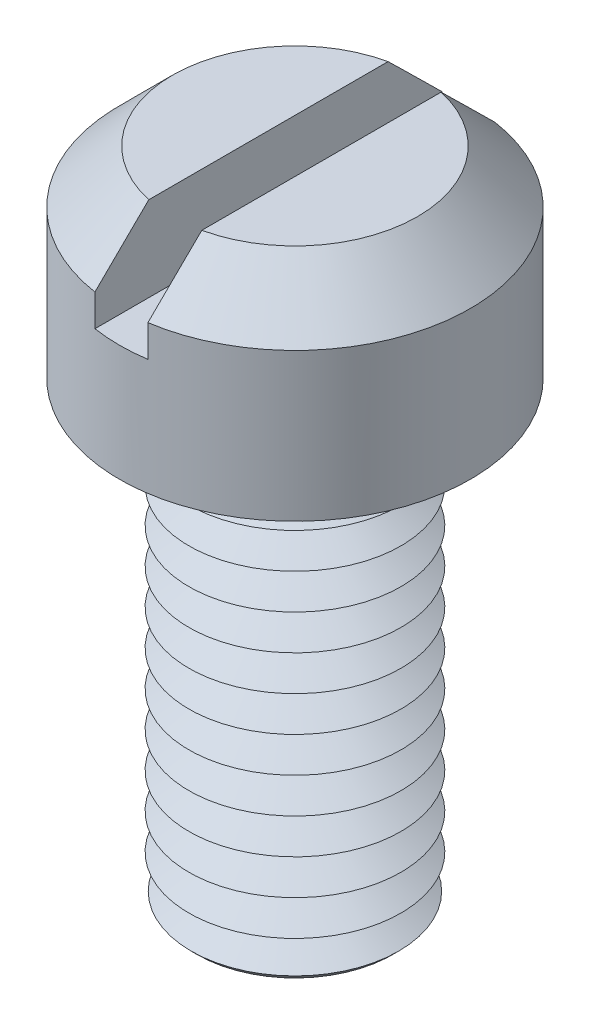
ISO-10303-21;
HEADER;
FILE_DESCRIPTION(('STEP AP214'),'2;1');
FILE_NAME('part.step','',(''),(''),'','','');
FILE_SCHEMA(('AUTOMOTIVE_DESIGN { 1 0 10303 214 1 1 1 1 }'));
ENDSEC;
DATA;
#1=APPLICATION_CONTEXT('core data for automotive mechanical design processes');
#2=APPLICATION_PROTOCOL_DEFINITION('international standard','automotive_design',2000,#1);
#3=PRODUCT_CONTEXT('',#1,'mechanical');
#4=PRODUCT('Part','Part','',(#3));
#5=PRODUCT_RELATED_PRODUCT_CATEGORY('part','',(#4));
#6=PRODUCT_DEFINITION_FORMATION('','',#4);
#7=PRODUCT_DEFINITION_CONTEXT('part definition',#1,'design');
#8=PRODUCT_DEFINITION('design','',#6,#7);
#9=PRODUCT_DEFINITION_SHAPE('','',#8);
#10=(LENGTH_UNIT() NAMED_UNIT(*) SI_UNIT(.MILLI.,.METRE.));
#11=(NAMED_UNIT(*) PLANE_ANGLE_UNIT() SI_UNIT($,.RADIAN.));
#12=(NAMED_UNIT(*) SI_UNIT($,.STERADIAN.) SOLID_ANGLE_UNIT());
#13=UNCERTAINTY_MEASURE_WITH_UNIT(LENGTH_MEASURE(1.E-05),#10,'distance_accuracy_value','');
#14=(GEOMETRIC_REPRESENTATION_CONTEXT(3) GLOBAL_UNCERTAINTY_ASSIGNED_CONTEXT((#13)) GLOBAL_UNIT_ASSIGNED_CONTEXT((#10,
#11,#12)) REPRESENTATION_CONTEXT('',''));
#15=CARTESIAN_POINT('',(0.,0.,0.));
#16=DIRECTION('',(0.,0.,1.));
#17=DIRECTION('',(1.,0.,0.));
#18=AXIS2_PLACEMENT_3D('',#15,#16,#17);
#19=CARTESIAN_POINT('',(1.2625832,2.0708112,0.));
#20=DIRECTION('',(0.,1.,0.));
#21=DIRECTION('',(0.,0.,1.));
#22=AXIS2_PLACEMENT_3D('',#19,#20,#21);
#23=PLANE('',#22);
#24=DIRECTION('',(0.,0.,1.));
#25=VECTOR('',#24,1.);
#26=CARTESIAN_POINT('',(-0.27305,2.0708112,-16.0764816511119));
#27=LINE('',#26,#25);
#28=CARTESIAN_POINT('',(-0.27305,2.0708112,-1.23270435807708));
#29=VERTEX_POINT('',#28);
#30=CARTESIAN_POINT('',(-0.27305,2.0708112,1.23270435807708));
#31=VERTEX_POINT('',#30);
#32=EDGE_CURVE('E86',#29,#31,#27,.T.);
#33=ORIENTED_EDGE('',*,*,#32,.F.);
#34=CARTESIAN_POINT('',(0.,2.0708112,0.));
#35=DIRECTION('',(0.,-1.,0.));
#36=DIRECTION('',(0.,0.,-1.));
#37=AXIS2_PLACEMENT_3D('',#34,#35,#36);
#38=CIRCLE('',#37,1.2625832);
#39=EDGE_CURVE('E95',#31,#29,#38,.T.);
#40=ORIENTED_EDGE('',*,*,#39,.F.);
#41=EDGE_LOOP('',(#33,#40));
#42=FACE_BOUND('',#41,.T.);
#43=ADVANCED_FACE('F32',(#42),#23,.T.);
#44=CARTESIAN_POINT('',(0.,1.5247112,0.));
#45=DIRECTION('',(0.,-1.,0.));
#46=DIRECTION('',(0.,0.,-1.));
#47=AXIS2_PLACEMENT_3D('',#44,#45,#46);
#48=CONICAL_SURFACE('',#47,1.8086832,0.785398163397452);
#49=CARTESIAN_POINT('',(-0.27305,-0.670502093232101,-3.99457517466081));
#50=CARTESIAN_POINT('',(-0.27305,-0.532743501954216,-3.85649244203936));
#51=CARTESIAN_POINT('',(-0.27305,-0.394999038745188,-3.71839559930553));
#52=CARTESIAN_POINT('',(-0.27305,-0.119553690384869,-3.44215193202548));
#53=CARTESIAN_POINT('',(-0.27305,0.0181471936555657,-3.30400510637165));
#54=CARTESIAN_POINT('',(-0.27305,0.29355811836415,-3.02757138990339));
#55=CARTESIAN_POINT('',(-0.27305,0.431268123568295,-2.8892844637545));
#56=CARTESIAN_POINT('',(-0.27305,0.706585658788172,-2.61261495548582));
#57=CARTESIAN_POINT('',(-0.27305,0.844193191098444,-2.47423237565038));
#58=CARTESIAN_POINT('',(-0.27305,1.11973373240248,-2.19681511027986));
#59=CARTESIAN_POINT('',(-0.27305,1.25766616513742,-2.05777985247029));
#60=CARTESIAN_POINT('',(-0.27305,1.53325800638488,-1.77941983139988));
#61=CARTESIAN_POINT('',(-0.27305,1.67091739578055,-1.64009504917592));
#62=CARTESIAN_POINT('',(-0.27305,1.87693359768065,-1.43068933920297));
#63=CARTESIAN_POINT('',(-0.27305,1.94551520818137,-1.36082961648617));
#64=CARTESIAN_POINT('',(-0.27305,2.08244301610567,-1.22087555600015));
#65=CARTESIAN_POINT('',(-0.27305,2.15078920708293,-1.15078121190849));
#66=CARTESIAN_POINT('',(-0.27305,2.28707167761759,-1.01021264326538));
#67=CARTESIAN_POINT('',(-0.27305,2.35500800747683,-0.939738467426579));
#68=CARTESIAN_POINT('',(-0.27305,2.49015756455895,-0.798100988856253));
#69=CARTESIAN_POINT('',(-0.27305,2.55737083504489,-0.726937727844574));
#70=CARTESIAN_POINT('',(-0.27305,2.64181728236521,-0.635433243349678));
#71=CARTESIAN_POINT('',(-0.27305,2.65981927614082,-0.615803159546204));
#72=CARTESIAN_POINT('',(-0.27305,2.69565472326073,-0.576388644290862));
#73=CARTESIAN_POINT('',(-0.27305,2.71348817154666,-0.556604208238902));
#74=CARTESIAN_POINT('',(-0.27305,2.74894836778317,-0.516819826621165));
#75=CARTESIAN_POINT('',(-0.27305,2.7665749283345,-0.496819713073399));
#76=CARTESIAN_POINT('',(-0.27305,2.80151416477243,-0.456551062853943));
#77=CARTESIAN_POINT('',(-0.27305,2.81882686131552,-0.436282543999979));
#78=CARTESIAN_POINT('',(-0.27305,2.86353511103527,-0.382818629339714));
#79=CARTESIAN_POINT('',(-0.27305,2.89059128785077,-0.349330956102617));
#80=CARTESIAN_POINT('',(-0.27305,2.9294959253438,-0.297826266492167));
#81=CARTESIAN_POINT('',(-0.27305,2.9421832998598,-0.280447208551324));
#82=CARTESIAN_POINT('',(-0.27305,2.96669883466568,-0.245097559607347));
#83=CARTESIAN_POINT('',(-0.27305,2.97852742850139,-0.227127273832052));
#84=CARTESIAN_POINT('',(-0.27305,3.00079829496485,-0.190461363836853));
#85=CARTESIAN_POINT('',(-0.27305,3.01124750560347,-0.171770032705802));
#86=CARTESIAN_POINT('',(-0.27305,3.02999784335078,-0.133319136469084));
#87=CARTESIAN_POINT('',(-0.27305,3.03830202355649,-0.113561138592454));
#88=CARTESIAN_POINT('',(-0.27305,3.04998937794698,-0.0773657560245886));
#89=CARTESIAN_POINT('',(-0.27305,3.05405408357777,-0.0611576770965087));
#90=CARTESIAN_POINT('',(-0.27305,3.05935542411927,-0.0283043030006355));
#91=CARTESIAN_POINT('',(-0.27305,3.06060025848282,-0.0116604181774456));
#92=CARTESIAN_POINT('',(-0.27305,3.05999800610169,0.0216049530590745));
#93=CARTESIAN_POINT('',(-0.27305,3.05814393619912,0.0382263041863533));
#94=CARTESIAN_POINT('',(-0.27305,3.05173842402711,0.0709505462754175));
#95=CARTESIAN_POINT('',(-0.27305,3.04718025593288,0.0870520385500609));
#96=CARTESIAN_POINT('',(-0.27305,3.0352858412563,0.120824759627516));
#97=CARTESIAN_POINT('',(-0.27305,3.02764174495537,0.138383218501545));
#98=CARTESIAN_POINT('',(-0.27305,3.01066839146767,0.172679835921953));
#99=CARTESIAN_POINT('',(-0.27305,3.0013356509551,0.189416206192335));
#100=CARTESIAN_POINT('',(-0.27305,2.98149860243591,0.22237090140512));
#101=CARTESIAN_POINT('',(-0.27305,2.97098463345682,0.23858331173284));
#102=CARTESIAN_POINT('',(-0.27305,2.94922961836882,0.270482843280437));
#103=CARTESIAN_POINT('',(-0.27305,2.93798930016294,0.286170467190459));
#104=CARTESIAN_POINT('',(-0.27305,2.9011739210663,0.335846327154306));
#105=CARTESIAN_POINT('',(-0.27305,2.87463987792527,0.369118440780245));
#106=CARTESIAN_POINT('',(-0.27305,2.82038440773294,0.434685670528269));
#107=CARTESIAN_POINT('',(-0.27305,2.79266229676699,0.466980205147229));
#108=CARTESIAN_POINT('',(-0.27305,2.73648427347563,0.531020112756568));
#109=CARTESIAN_POINT('',(-0.27305,2.70802720933309,0.562764474804895));
#110=CARTESIAN_POINT('',(-0.27305,2.65069398421821,0.625854747084333));
#111=CARTESIAN_POINT('',(-0.27305,2.62181793478477,0.657200759339066));
#112=CARTESIAN_POINT('',(-0.27305,2.53504619814765,0.750558636192267));
#113=CARTESIAN_POINT('',(-0.27305,2.47673978737696,0.812188172853045));
#114=CARTESIAN_POINT('',(-0.27305,2.35963624039586,0.93486240885009));
#115=CARTESIAN_POINT('',(-0.27305,2.30083963000779,0.99590761359902));
#116=CARTESIAN_POINT('',(-0.27305,2.12215621990625,1.1804787652528));
#117=CARTESIAN_POINT('',(-0.27305,2.00178360140104,1.3035340410143));
#118=CARTESIAN_POINT('',(-0.27305,1.76052653862261,1.54914383709942));
#119=CARTESIAN_POINT('',(-0.27305,1.63964208431354,1.6716983475108));
#120=CARTESIAN_POINT('',(-0.27305,1.39753876398271,1.91659214765937));
#121=CARTESIAN_POINT('',(-0.27305,1.27631976628164,2.03893130735173));
#122=CARTESIAN_POINT('',(-0.27305,1.03372474745032,2.2834517814165));
#123=CARTESIAN_POINT('',(-0.27305,0.912348727527343,2.40563309698824));
#124=CARTESIAN_POINT('',(-0.27305,0.54755124084544,2.77255725983145));
#125=CARTESIAN_POINT('',(-0.27305,0.303982373837481,3.01715356856809));
#126=CARTESIAN_POINT('',(-0.27305,-0.0614420244602978,3.38385157729834));
#127=CARTESIAN_POINT('',(-0.27305,-0.183230617478816,3.5060200516536));
#128=CARTESIAN_POINT('',(-0.27305,-0.426842566146336,3.75032166568043));
#129=CARTESIAN_POINT('',(-0.27305,-0.548665921698652,3.87245480544841));
#130=CARTESIAN_POINT('',(-0.27305,-0.670502093232101,3.99457517466081));
#131=B_SPLINE_CURVE_WITH_KNOTS('',3,(#49,#50,#51,#52,#53,#54,#55,#56,#57,#58,#59,#60,#61,#62,
#63,#64,#65,#66,#67,#68,#69,#70,#71,#72,#73,#74,#75,#76,#77,#78,#79,#80,#81,#82,#83,#84,#85,#86,
#87,#88,#89,#90,#91,#92,#93,#94,#95,#96,#97,#98,#99,#100,#101,#102,#103,#104,#105,#106,#107,
#108,#109,#110,#111,#112,#113,#114,#115,#116,#117,#118,#119,#120,#121,#122,#123,#124,#125,#126,
#127,#128,#129,#130),.UNSPECIFIED.,.F.,.F.,(4,2,2,2,2,2,2,2,2,2,2,2,2,2,2,2,2,2,2,2,2,2,2,2,2,2,
2,2,2,2,2,2,2,2,2,2,2,2,2,2,4),(0.,0.585148232338538,1.17031034071826,1.75578950392684,
2.34125513740581,2.92879692748821,3.51637849600159,3.81006923278803,4.1037679485656,
4.39742985419415,4.69107409021423,4.77097762606449,4.85088355241081,4.93085700059561,
5.01082516620193,5.13991833554693,5.20445511581137,5.26895908552851,5.33312513249446,
5.39719934006627,5.44713494673529,5.49692516622787,5.54682773573501,5.59685494994307,
5.6541658416076,5.71159633033682,5.76953642388336,5.82741932780626,5.9550200729413,
6.08269528527661,6.21058444875507,6.33844016947771,6.59295157416525,6.84721822957657,
7.3636323805298,7.88005670442245,8.39672658465497,8.91339251579066,9.94894919912361,
10.4664609237501,10.9839712227619),.UNSPECIFIED.);
#132=CARTESIAN_POINT('',(-0.27305,1.5247112,-1.78795375092932));
#133=VERTEX_POINT('',#132);
#134=EDGE_CURVE('E83',#133,#29,#131,.T.);
#135=ORIENTED_EDGE('',*,*,#134,.F.);
#136=CARTESIAN_POINT('',(0.,1.5247112,0.));
#137=DIRECTION('',(0.,-1.,0.));
#138=DIRECTION('',(0.,0.,-1.));
#139=AXIS2_PLACEMENT_3D('',#136,#137,#138);
#140=CIRCLE('',#139,1.8086832);
#141=CARTESIAN_POINT('',(-0.27305,1.5247112,1.78795375092932));
#142=VERTEX_POINT('',#141);
#143=EDGE_CURVE('E101',#142,#133,#140,.T.);
#144=ORIENTED_EDGE('',*,*,#143,.F.);
#145=EDGE_CURVE('E92',#31,#142,#131,.T.);
#146=ORIENTED_EDGE('',*,*,#145,.F.);
#147=ORIENTED_EDGE('',*,*,#39,.T.);
#148=EDGE_LOOP('',(#135,#144,#146,#147));
#149=FACE_BOUND('',#148,.T.);
#150=ADVANCED_FACE('F97',(#149),#48,.T.);
#151=CARTESIAN_POINT('',(0.,-4.41113333333331,0.));
#152=DIRECTION('',(0.,-1.,0.));
#153=DIRECTION('',(0.,0.,-1.));
#154=AXIS2_PLACEMENT_3D('',#151,#152,#153);
#155=CONICAL_SURFACE('',#154,0.776909017995548,1.0471975511966);
#156=CARTESIAN_POINT('',(0.,-4.57984090179954,0.));
#157=DIRECTION('',(0.,-1.,0.));
#158=DIRECTION('',(0.,0.,-1.));
#159=AXIS2_PLACEMENT_3D('',#156,#157,#158);
#160=CIRCLE('',#159,1.06911909820046);
#161=CARTESIAN_POINT('',(0.,-4.57984090179954,-1.06911909820046));
#162=VERTEX_POINT('',#161);
#163=EDGE_CURVE('E191',#162,#162,#160,.F.);
#164=ORIENTED_EDGE('',*,*,#163,.T.);
#165=EDGE_LOOP('',(#164));
#166=FACE_BOUND('',#165,.T.);
#167=CARTESIAN_POINT('',(0.,-4.41113333333331,0.));
#168=DIRECTION('',(0.,-1.,0.));
#169=DIRECTION('',(0.,0.,-1.));
#170=AXIS2_PLACEMENT_3D('',#167,#168,#169);
#171=CIRCLE('',#170,0.776909017995548);
#172=CARTESIAN_POINT('',(0.,-4.41113333333331,-0.776909017995548));
#173=VERTEX_POINT('',#172);
#174=EDGE_CURVE('E185',#173,#173,#171,.T.);
#175=ORIENTED_EDGE('',*,*,#174,.T.);
#176=EDGE_LOOP('',(#175));
#177=FACE_BOUND('',#176,.T.);
#178=ADVANCED_FACE('F231',(#166,#177),#155,.T.);
#179=CARTESIAN_POINT('',(0.,-4.22909999999997,0.));
#180=DIRECTION('',(0.,1.,0.));
#181=DIRECTION('',(0.,0.,1.));
#182=AXIS2_PLACEMENT_3D('',#179,#180,#181);
#183=CONICAL_SURFACE('',#182,1.0922,1.04719755119658);
#184=ORIENTED_EDGE('',*,*,#174,.F.);
#185=EDGE_LOOP('',(#184));
#186=FACE_BOUND('',#185,.T.);
#187=CARTESIAN_POINT('',(0.,-4.22909999999997,0.));
#188=DIRECTION('',(0.,-1.,0.));
#189=DIRECTION('',(0.,0.,-1.));
#190=AXIS2_PLACEMENT_3D('',#187,#188,#189);
#191=CIRCLE('',#190,1.0922);
#192=CARTESIAN_POINT('',(0.,-4.22909999999997,-1.0922));
#193=VERTEX_POINT('',#192);
#194=EDGE_CURVE('E182',#193,#193,#191,.T.);
#195=ORIENTED_EDGE('',*,*,#194,.T.);
#196=EDGE_LOOP('',(#195));
#197=FACE_BOUND('',#196,.T.);
#198=ADVANCED_FACE('F575',(#186,#197),#183,.T.);
#199=CARTESIAN_POINT('',(0.,-4.04706666666664,0.));
#200=DIRECTION('',(0.,-1.,0.));
#201=DIRECTION('',(0.,0.,-1.));
#202=AXIS2_PLACEMENT_3D('',#199,#200,#201);
#203=CONICAL_SURFACE('',#202,0.776909017995548,1.0471975511966);
#204=ORIENTED_EDGE('',*,*,#194,.F.);
#205=EDGE_LOOP('',(#204));
#206=FACE_BOUND('',#205,.T.);
#207=CARTESIAN_POINT('',(0.,-4.04706666666664,0.));
#208=DIRECTION('',(0.,-1.,0.));
#209=DIRECTION('',(0.,0.,-1.));
#210=AXIS2_PLACEMENT_3D('',#207,#208,#209);
#211=CIRCLE('',#210,0.776909017995548);
#212=CARTESIAN_POINT('',(0.,-4.04706666666664,-0.776909017995548));
#213=VERTEX_POINT('',#212);
#214=EDGE_CURVE('E179',#213,#213,#211,.T.);
#215=ORIENTED_EDGE('',*,*,#214,.T.);
#216=EDGE_LOOP('',(#215));
#217=FACE_BOUND('',#216,.T.);
#218=ADVANCED_FACE('F565',(#206,#217),#203,.T.);
#219=CARTESIAN_POINT('',(0.,-3.86503333333331,0.));
#220=DIRECTION('',(0.,1.,0.));
#221=DIRECTION('',(0.,0.,1.));
#222=AXIS2_PLACEMENT_3D('',#219,#220,#221);
#223=CONICAL_SURFACE('',#222,1.0922,1.0471975511966);
#224=ORIENTED_EDGE('',*,*,#214,.F.);
#225=EDGE_LOOP('',(#224));
#226=FACE_BOUND('',#225,.T.);
#227=CARTESIAN_POINT('',(0.,-3.86503333333331,0.));
#228=DIRECTION('',(0.,-1.,0.));
#229=DIRECTION('',(0.,0.,-1.));
#230=AXIS2_PLACEMENT_3D('',#227,#228,#229);
#231=CIRCLE('',#230,1.0922);
#232=CARTESIAN_POINT('',(0.,-3.86503333333331,-1.0922));
#233=VERTEX_POINT('',#232);
#234=EDGE_CURVE('E176',#233,#233,#231,.T.);
#235=ORIENTED_EDGE('',*,*,#234,.T.);
#236=EDGE_LOOP('',(#235));
#237=FACE_BOUND('',#236,.T.);
#238=ADVANCED_FACE('F555',(#226,#237),#223,.T.);
#239=CARTESIAN_POINT('',(0.,-3.68299999999998,0.));
#240=DIRECTION('',(0.,-1.,0.));
#241=DIRECTION('',(0.,0.,-1.));
#242=AXIS2_PLACEMENT_3D('',#239,#240,#241);
#243=CONICAL_SURFACE('',#242,0.776909017995548,1.0471975511966);
#244=ORIENTED_EDGE('',*,*,#234,.F.);
#245=EDGE_LOOP('',(#244));
#246=FACE_BOUND('',#245,.T.);
#247=CARTESIAN_POINT('',(0.,-3.68299999999998,0.));
#248=DIRECTION('',(0.,-1.,0.));
#249=DIRECTION('',(0.,0.,-1.));
#250=AXIS2_PLACEMENT_3D('',#247,#248,#249);
#251=CIRCLE('',#250,0.776909017995548);
#252=CARTESIAN_POINT('',(0.,-3.68299999999998,-0.776909017995548));
#253=VERTEX_POINT('',#252);
#254=EDGE_CURVE('E173',#253,#253,#251,.T.);
#255=ORIENTED_EDGE('',*,*,#254,.T.);
#256=EDGE_LOOP('',(#255));
#257=FACE_BOUND('',#256,.T.);
#258=ADVANCED_FACE('F545',(#246,#257),#243,.T.);
#259=CARTESIAN_POINT('',(0.,-3.50096666666665,0.));
#260=DIRECTION('',(0.,1.,0.));
#261=DIRECTION('',(0.,0.,1.));
#262=AXIS2_PLACEMENT_3D('',#259,#260,#261);
#263=CONICAL_SURFACE('',#262,1.0922,1.0471975511966);
#264=ORIENTED_EDGE('',*,*,#254,.F.);
#265=EDGE_LOOP('',(#264));
#266=FACE_BOUND('',#265,.T.);
#267=CARTESIAN_POINT('',(0.,-3.50096666666665,0.));
#268=DIRECTION('',(0.,-1.,0.));
#269=DIRECTION('',(0.,0.,-1.));
#270=AXIS2_PLACEMENT_3D('',#267,#268,#269);
#271=CIRCLE('',#270,1.0922);
#272=CARTESIAN_POINT('',(0.,-3.50096666666665,-1.0922));
#273=VERTEX_POINT('',#272);
#274=EDGE_CURVE('E170',#273,#273,#271,.T.);
#275=ORIENTED_EDGE('',*,*,#274,.T.);
#276=EDGE_LOOP('',(#275));
#277=FACE_BOUND('',#276,.T.);
#278=ADVANCED_FACE('F535',(#266,#277),#263,.T.);
#279=CARTESIAN_POINT('',(0.,-3.31893333333332,0.));
#280=DIRECTION('',(0.,-1.,0.));
#281=DIRECTION('',(0.,0.,-1.));
#282=AXIS2_PLACEMENT_3D('',#279,#280,#281);
#283=CONICAL_SURFACE('',#282,0.776909017995548,1.0471975511966);
#284=ORIENTED_EDGE('',*,*,#274,.F.);
#285=EDGE_LOOP('',(#284));
#286=FACE_BOUND('',#285,.T.);
#287=CARTESIAN_POINT('',(0.,-3.31893333333332,0.));
#288=DIRECTION('',(0.,-1.,0.));
#289=DIRECTION('',(0.,0.,-1.));
#290=AXIS2_PLACEMENT_3D('',#287,#288,#289);
#291=CIRCLE('',#290,0.776909017995548);
#292=CARTESIAN_POINT('',(0.,-3.31893333333332,-0.776909017995548));
#293=VERTEX_POINT('',#292);
#294=EDGE_CURVE('E167',#293,#293,#291,.T.);
#295=ORIENTED_EDGE('',*,*,#294,.T.);
#296=EDGE_LOOP('',(#295));
#297=FACE_BOUND('',#296,.T.);
#298=ADVANCED_FACE('F525',(#286,#297),#283,.T.);
#299=CARTESIAN_POINT('',(0.,-3.13689999999998,0.));
#300=DIRECTION('',(0.,1.,0.));
#301=DIRECTION('',(0.,0.,1.));
#302=AXIS2_PLACEMENT_3D('',#299,#300,#301);
#303=CONICAL_SURFACE('',#302,1.0922,1.0471975511966);
#304=ORIENTED_EDGE('',*,*,#294,.F.);
#305=EDGE_LOOP('',(#304));
#306=FACE_BOUND('',#305,.T.);
#307=CARTESIAN_POINT('',(0.,-3.13689999999998,0.));
#308=DIRECTION('',(0.,-1.,0.));
#309=DIRECTION('',(0.,0.,-1.));
#310=AXIS2_PLACEMENT_3D('',#307,#308,#309);
#311=CIRCLE('',#310,1.0922);
#312=CARTESIAN_POINT('',(0.,-3.13689999999998,-1.0922));
#313=VERTEX_POINT('',#312);
#314=EDGE_CURVE('E164',#313,#313,#311,.T.);
#315=ORIENTED_EDGE('',*,*,#314,.T.);
#316=EDGE_LOOP('',(#315));
#317=FACE_BOUND('',#316,.T.);
#318=ADVANCED_FACE('F515',(#306,#317),#303,.T.);
#319=CARTESIAN_POINT('',(0.,-2.95486666666665,0.));
#320=DIRECTION('',(0.,-1.,0.));
#321=DIRECTION('',(0.,0.,-1.));
#322=AXIS2_PLACEMENT_3D('',#319,#320,#321);
#323=CONICAL_SURFACE('',#322,0.776909017995548,1.0471975511966);
#324=ORIENTED_EDGE('',*,*,#314,.F.);
#325=EDGE_LOOP('',(#324));
#326=FACE_BOUND('',#325,.T.);
#327=CARTESIAN_POINT('',(0.,-2.95486666666665,0.));
#328=DIRECTION('',(0.,-1.,0.));
#329=DIRECTION('',(0.,0.,-1.));
#330=AXIS2_PLACEMENT_3D('',#327,#328,#329);
#331=CIRCLE('',#330,0.776909017995548);
#332=CARTESIAN_POINT('',(0.,-2.95486666666665,-0.776909017995548));
#333=VERTEX_POINT('',#332);
#334=EDGE_CURVE('E161',#333,#333,#331,.T.);
#335=ORIENTED_EDGE('',*,*,#334,.T.);
#336=EDGE_LOOP('',(#335));
#337=FACE_BOUND('',#336,.T.);
#338=ADVANCED_FACE('F505',(#326,#337),#323,.T.);
#339=CARTESIAN_POINT('',(0.,-2.77283333333332,0.));
#340=DIRECTION('',(0.,1.,0.));
#341=DIRECTION('',(0.,0.,1.));
#342=AXIS2_PLACEMENT_3D('',#339,#340,#341);
#343=CONICAL_SURFACE('',#342,1.0922,1.0471975511966);
#344=ORIENTED_EDGE('',*,*,#334,.F.);
#345=EDGE_LOOP('',(#344));
#346=FACE_BOUND('',#345,.T.);
#347=CARTESIAN_POINT('',(0.,-2.77283333333332,0.));
#348=DIRECTION('',(0.,-1.,0.));
#349=DIRECTION('',(0.,0.,-1.));
#350=AXIS2_PLACEMENT_3D('',#347,#348,#349);
#351=CIRCLE('',#350,1.0922);
#352=CARTESIAN_POINT('',(0.,-2.77283333333332,-1.0922));
#353=VERTEX_POINT('',#352);
#354=EDGE_CURVE('E158',#353,#353,#351,.T.);
#355=ORIENTED_EDGE('',*,*,#354,.T.);
#356=EDGE_LOOP('',(#355));
#357=FACE_BOUND('',#356,.T.);
#358=ADVANCED_FACE('F495',(#346,#357),#343,.T.);
#359=CARTESIAN_POINT('',(0.,-2.59079999999998,0.));
#360=DIRECTION('',(0.,-1.,0.));
#361=DIRECTION('',(0.,0.,-1.));
#362=AXIS2_PLACEMENT_3D('',#359,#360,#361);
#363=CONICAL_SURFACE('',#362,0.776909017995548,1.04719755119658);
#364=ORIENTED_EDGE('',*,*,#354,.F.);
#365=EDGE_LOOP('',(#364));
#366=FACE_BOUND('',#365,.T.);
#367=CARTESIAN_POINT('',(0.,-2.59079999999998,0.));
#368=DIRECTION('',(0.,-1.,0.));
#369=DIRECTION('',(0.,0.,-1.));
#370=AXIS2_PLACEMENT_3D('',#367,#368,#369);
#371=CIRCLE('',#370,0.776909017995548);
#372=CARTESIAN_POINT('',(0.,-2.59079999999998,-0.776909017995548));
#373=VERTEX_POINT('',#372);
#374=EDGE_CURVE('E155',#373,#373,#371,.T.);
#375=ORIENTED_EDGE('',*,*,#374,.T.);
#376=EDGE_LOOP('',(#375));
#377=FACE_BOUND('',#376,.T.);
#378=ADVANCED_FACE('F485',(#366,#377),#363,.T.);
#379=CARTESIAN_POINT('',(0.,-2.40876666666665,0.));
#380=DIRECTION('',(0.,1.,0.));
#381=DIRECTION('',(0.,0.,1.));
#382=AXIS2_PLACEMENT_3D('',#379,#380,#381);
#383=CONICAL_SURFACE('',#382,1.0922,1.0471975511966);
#384=ORIENTED_EDGE('',*,*,#374,.F.);
#385=EDGE_LOOP('',(#384));
#386=FACE_BOUND('',#385,.T.);
#387=CARTESIAN_POINT('',(0.,-2.40876666666665,0.));
#388=DIRECTION('',(0.,-1.,0.));
#389=DIRECTION('',(0.,0.,-1.));
#390=AXIS2_PLACEMENT_3D('',#387,#388,#389);
#391=CIRCLE('',#390,1.0922);
#392=CARTESIAN_POINT('',(0.,-2.40876666666665,-1.0922));
#393=VERTEX_POINT('',#392);
#394=EDGE_CURVE('E152',#393,#393,#391,.T.);
#395=ORIENTED_EDGE('',*,*,#394,.T.);
#396=EDGE_LOOP('',(#395));
#397=FACE_BOUND('',#396,.T.);
#398=ADVANCED_FACE('F475',(#386,#397),#383,.T.);
#399=CARTESIAN_POINT('',(0.,-2.22673333333332,0.));
#400=DIRECTION('',(0.,-1.,0.));
#401=DIRECTION('',(0.,0.,-1.));
#402=AXIS2_PLACEMENT_3D('',#399,#400,#401);
#403=CONICAL_SURFACE('',#402,0.776909017995548,1.0471975511966);
#404=ORIENTED_EDGE('',*,*,#394,.F.);
#405=EDGE_LOOP('',(#404));
#406=FACE_BOUND('',#405,.T.);
#407=CARTESIAN_POINT('',(0.,-2.22673333333332,0.));
#408=DIRECTION('',(0.,-1.,0.));
#409=DIRECTION('',(0.,0.,-1.));
#410=AXIS2_PLACEMENT_3D('',#407,#408,#409);
#411=CIRCLE('',#410,0.776909017995548);
#412=CARTESIAN_POINT('',(0.,-2.22673333333332,-0.776909017995548));
#413=VERTEX_POINT('',#412);
#414=EDGE_CURVE('E149',#413,#413,#411,.T.);
#415=ORIENTED_EDGE('',*,*,#414,.T.);
#416=EDGE_LOOP('',(#415));
#417=FACE_BOUND('',#416,.T.);
#418=ADVANCED_FACE('F465',(#406,#417),#403,.T.);
#419=CARTESIAN_POINT('',(0.,-2.04469999999999,0.));
#420=DIRECTION('',(0.,1.,0.));
#421=DIRECTION('',(0.,0.,1.));
#422=AXIS2_PLACEMENT_3D('',#419,#420,#421);
#423=CONICAL_SURFACE('',#422,1.0922,1.0471975511966);
#424=ORIENTED_EDGE('',*,*,#414,.F.);
#425=EDGE_LOOP('',(#424));
#426=FACE_BOUND('',#425,.T.);
#427=CARTESIAN_POINT('',(0.,-2.04469999999999,0.));
#428=DIRECTION('',(0.,-1.,0.));
#429=DIRECTION('',(0.,0.,-1.));
#430=AXIS2_PLACEMENT_3D('',#427,#428,#429);
#431=CIRCLE('',#430,1.0922);
#432=CARTESIAN_POINT('',(0.,-2.04469999999999,-1.0922));
#433=VERTEX_POINT('',#432);
#434=EDGE_CURVE('E146',#433,#433,#431,.T.);
#435=ORIENTED_EDGE('',*,*,#434,.T.);
#436=EDGE_LOOP('',(#435));
#437=FACE_BOUND('',#436,.T.);
#438=ADVANCED_FACE('F455',(#426,#437),#423,.T.);
#439=CARTESIAN_POINT('',(0.,-1.86266666666665,0.));
#440=DIRECTION('',(0.,-1.,0.));
#441=DIRECTION('',(0.,0.,-1.));
#442=AXIS2_PLACEMENT_3D('',#439,#440,#441);
#443=CONICAL_SURFACE('',#442,0.776909017995548,1.04719755119658);
#444=ORIENTED_EDGE('',*,*,#434,.F.);
#445=EDGE_LOOP('',(#444));
#446=FACE_BOUND('',#445,.T.);
#447=CARTESIAN_POINT('',(0.,-1.86266666666665,0.));
#448=DIRECTION('',(0.,-1.,0.));
#449=DIRECTION('',(0.,0.,-1.));
#450=AXIS2_PLACEMENT_3D('',#447,#448,#449);
#451=CIRCLE('',#450,0.776909017995548);
#452=CARTESIAN_POINT('',(0.,-1.86266666666665,-0.776909017995548));
#453=VERTEX_POINT('',#452);
#454=EDGE_CURVE('E143',#453,#453,#451,.T.);
#455=ORIENTED_EDGE('',*,*,#454,.T.);
#456=EDGE_LOOP('',(#455));
#457=FACE_BOUND('',#456,.T.);
#458=ADVANCED_FACE('F445',(#446,#457),#443,.T.);
#459=CARTESIAN_POINT('',(0.,-1.68063333333332,0.));
#460=DIRECTION('',(0.,1.,0.));
#461=DIRECTION('',(0.,0.,1.));
#462=AXIS2_PLACEMENT_3D('',#459,#460,#461);
#463=CONICAL_SURFACE('',#462,1.0922,1.0471975511966);
#464=ORIENTED_EDGE('',*,*,#454,.F.);
#465=EDGE_LOOP('',(#464));
#466=FACE_BOUND('',#465,.T.);
#467=CARTESIAN_POINT('',(0.,-1.68063333333332,0.));
#468=DIRECTION('',(0.,-1.,0.));
#469=DIRECTION('',(0.,0.,-1.));
#470=AXIS2_PLACEMENT_3D('',#467,#468,#469);
#471=CIRCLE('',#470,1.0922);
#472=CARTESIAN_POINT('',(0.,-1.68063333333332,-1.0922));
#473=VERTEX_POINT('',#472);
#474=EDGE_CURVE('E140',#473,#473,#471,.T.);
#475=ORIENTED_EDGE('',*,*,#474,.T.);
#476=EDGE_LOOP('',(#475));
#477=FACE_BOUND('',#476,.T.);
#478=ADVANCED_FACE('F435',(#466,#477),#463,.T.);
#479=CARTESIAN_POINT('',(0.,-1.49859999999999,0.));
#480=DIRECTION('',(0.,-1.,0.));
#481=DIRECTION('',(0.,0.,-1.));
#482=AXIS2_PLACEMENT_3D('',#479,#480,#481);
#483=CONICAL_SURFACE('',#482,0.776909017995548,1.0471975511966);
#484=ORIENTED_EDGE('',*,*,#474,.F.);
#485=EDGE_LOOP('',(#484));
#486=FACE_BOUND('',#485,.T.);
#487=CARTESIAN_POINT('',(0.,-1.49859999999999,0.));
#488=DIRECTION('',(0.,-1.,0.));
#489=DIRECTION('',(0.,0.,-1.));
#490=AXIS2_PLACEMENT_3D('',#487,#488,#489);
#491=CIRCLE('',#490,0.776909017995548);
#492=CARTESIAN_POINT('',(0.,-1.49859999999999,-0.776909017995548));
#493=VERTEX_POINT('',#492);
#494=EDGE_CURVE('E137',#493,#493,#491,.T.);
#495=ORIENTED_EDGE('',*,*,#494,.T.);
#496=EDGE_LOOP('',(#495));
#497=FACE_BOUND('',#496,.T.);
#498=ADVANCED_FACE('F425',(#486,#497),#483,.T.);
#499=CARTESIAN_POINT('',(0.,-1.31656666666666,0.));
#500=DIRECTION('',(0.,1.,0.));
#501=DIRECTION('',(0.,0.,1.));
#502=AXIS2_PLACEMENT_3D('',#499,#500,#501);
#503=CONICAL_SURFACE('',#502,1.0922,1.0471975511966);
#504=ORIENTED_EDGE('',*,*,#494,.F.);
#505=EDGE_LOOP('',(#504));
#506=FACE_BOUND('',#505,.T.);
#507=CARTESIAN_POINT('',(0.,-1.31656666666666,0.));
#508=DIRECTION('',(0.,-1.,0.));
#509=DIRECTION('',(0.,0.,-1.));
#510=AXIS2_PLACEMENT_3D('',#507,#508,#509);
#511=CIRCLE('',#510,1.0922);
#512=CARTESIAN_POINT('',(0.,-1.31656666666666,-1.0922));
#513=VERTEX_POINT('',#512);
#514=EDGE_CURVE('E134',#513,#513,#511,.T.);
#515=ORIENTED_EDGE('',*,*,#514,.T.);
#516=EDGE_LOOP('',(#515));
#517=FACE_BOUND('',#516,.T.);
#518=ADVANCED_FACE('F415',(#506,#517),#503,.T.);
#519=CARTESIAN_POINT('',(0.,-1.13453333333333,0.));
#520=DIRECTION('',(0.,-1.,0.));
#521=DIRECTION('',(0.,0.,-1.));
#522=AXIS2_PLACEMENT_3D('',#519,#520,#521);
#523=CONICAL_SURFACE('',#522,0.776909017995548,1.0471975511966);
#524=ORIENTED_EDGE('',*,*,#514,.F.);
#525=EDGE_LOOP('',(#524));
#526=FACE_BOUND('',#525,.T.);
#527=CARTESIAN_POINT('',(0.,-1.13453333333333,0.));
#528=DIRECTION('',(0.,-1.,0.));
#529=DIRECTION('',(0.,0.,-1.));
#530=AXIS2_PLACEMENT_3D('',#527,#528,#529);
#531=CIRCLE('',#530,0.776909017995548);
#532=CARTESIAN_POINT('',(0.,-1.13453333333333,-0.776909017995548));
#533=VERTEX_POINT('',#532);
#534=EDGE_CURVE('E131',#533,#533,#531,.T.);
#535=ORIENTED_EDGE('',*,*,#534,.T.);
#536=EDGE_LOOP('',(#535));
#537=FACE_BOUND('',#536,.T.);
#538=ADVANCED_FACE('F405',(#526,#537),#523,.T.);
#539=CARTESIAN_POINT('',(0.,-0.952499999999995,0.));
#540=DIRECTION('',(0.,1.,0.));
#541=DIRECTION('',(0.,0.,1.));
#542=AXIS2_PLACEMENT_3D('',#539,#540,#541);
#543=CONICAL_SURFACE('',#542,1.0922,1.0471975511966);
#544=ORIENTED_EDGE('',*,*,#534,.F.);
#545=EDGE_LOOP('',(#544));
#546=FACE_BOUND('',#545,.T.);
#547=CARTESIAN_POINT('',(0.,-0.952499999999995,0.));
#548=DIRECTION('',(0.,-1.,0.));
#549=DIRECTION('',(0.,0.,-1.));
#550=AXIS2_PLACEMENT_3D('',#547,#548,#549);
#551=CIRCLE('',#550,1.0922);
#552=CARTESIAN_POINT('',(0.,-0.952499999999995,-1.0922));
#553=VERTEX_POINT('',#552);
#554=EDGE_CURVE('E128',#553,#553,#551,.T.);
#555=ORIENTED_EDGE('',*,*,#554,.T.);
#556=EDGE_LOOP('',(#555));
#557=FACE_BOUND('',#556,.T.);
#558=ADVANCED_FACE('F395',(#546,#557),#543,.T.);
#559=CARTESIAN_POINT('',(0.,-0.770466666666657,0.));
#560=DIRECTION('',(0.,-1.,0.));
#561=DIRECTION('',(0.,0.,-1.));
#562=AXIS2_PLACEMENT_3D('',#559,#560,#561);
#563=CONICAL_SURFACE('',#562,0.776909017995548,1.04719755119658);
#564=ORIENTED_EDGE('',*,*,#554,.F.);
#565=EDGE_LOOP('',(#564));
#566=FACE_BOUND('',#565,.T.);
#567=CARTESIAN_POINT('',(0.,-0.770466666666657,0.));
#568=DIRECTION('',(0.,-1.,0.));
#569=DIRECTION('',(0.,0.,-1.));
#570=AXIS2_PLACEMENT_3D('',#567,#568,#569);
#571=CIRCLE('',#570,0.776909017995548);
#572=CARTESIAN_POINT('',(0.,-0.770466666666657,-0.776909017995548));
#573=VERTEX_POINT('',#572);
#574=EDGE_CURVE('E125',#573,#573,#571,.T.);
#575=ORIENTED_EDGE('',*,*,#574,.T.);
#576=EDGE_LOOP('',(#575));
#577=FACE_BOUND('',#576,.T.);
#578=ADVANCED_FACE('F385',(#566,#577),#563,.T.);
#579=CARTESIAN_POINT('',(0.,-0.588433333333326,0.));
#580=DIRECTION('',(0.,1.,0.));
#581=DIRECTION('',(0.,0.,1.));
#582=AXIS2_PLACEMENT_3D('',#579,#580,#581);
#583=CONICAL_SURFACE('',#582,1.0922,1.0471975511966);
#584=ORIENTED_EDGE('',*,*,#574,.F.);
#585=EDGE_LOOP('',(#584));
#586=FACE_BOUND('',#585,.T.);
#587=CARTESIAN_POINT('',(0.,-0.588433333333326,0.));
#588=DIRECTION('',(0.,-1.,0.));
#589=DIRECTION('',(0.,0.,-1.));
#590=AXIS2_PLACEMENT_3D('',#587,#588,#589);
#591=CIRCLE('',#590,1.0922);
#592=CARTESIAN_POINT('',(0.,-0.588433333333326,-1.0922));
#593=VERTEX_POINT('',#592);
#594=EDGE_CURVE('E122',#593,#593,#591,.T.);
#595=ORIENTED_EDGE('',*,*,#594,.T.);
#596=EDGE_LOOP('',(#595));
#597=FACE_BOUND('',#596,.T.);
#598=ADVANCED_FACE('F375',(#586,#597),#583,.T.);
#599=CARTESIAN_POINT('',(0.,-0.406399999999994,0.));
#600=DIRECTION('',(0.,-1.,0.));
#601=DIRECTION('',(0.,0.,-1.));
#602=AXIS2_PLACEMENT_3D('',#599,#600,#601);
#603=CONICAL_SURFACE('',#602,0.776909017995548,1.0471975511966);
#604=ORIENTED_EDGE('',*,*,#594,.F.);
#605=EDGE_LOOP('',(#604));
#606=FACE_BOUND('',#605,.T.);
#607=CARTESIAN_POINT('',(0.,-0.406399999999994,0.));
#608=DIRECTION('',(0.,-1.,0.));
#609=DIRECTION('',(0.,0.,-1.));
#610=AXIS2_PLACEMENT_3D('',#607,#608,#609);
#611=CIRCLE('',#610,0.776909017995548);
#612=CARTESIAN_POINT('',(0.,-0.406399999999994,-0.776909017995548));
#613=VERTEX_POINT('',#612);
#614=EDGE_CURVE('E119',#613,#613,#611,.T.);
#615=ORIENTED_EDGE('',*,*,#614,.T.);
#616=EDGE_LOOP('',(#615));
#617=FACE_BOUND('',#616,.T.);
#618=ADVANCED_FACE('F365',(#606,#617),#603,.T.);
#619=CARTESIAN_POINT('',(0.,-0.224366666666656,0.));
#620=DIRECTION('',(0.,1.,0.));
#621=DIRECTION('',(0.,0.,1.));
#622=AXIS2_PLACEMENT_3D('',#619,#620,#621);
#623=CONICAL_SURFACE('',#622,1.0922,1.04719755119658);
#624=ORIENTED_EDGE('',*,*,#614,.F.);
#625=EDGE_LOOP('',(#624));
#626=FACE_BOUND('',#625,.T.);
#627=CARTESIAN_POINT('',(0.,-0.224366666666656,0.));
#628=DIRECTION('',(0.,-1.,0.));
#629=DIRECTION('',(0.,0.,-1.));
#630=AXIS2_PLACEMENT_3D('',#627,#628,#629);
#631=CIRCLE('',#630,1.0922);
#632=CARTESIAN_POINT('',(0.,-0.224366666666656,-1.0922));
#633=VERTEX_POINT('',#632);
#634=EDGE_CURVE('E116',#633,#633,#631,.T.);
#635=ORIENTED_EDGE('',*,*,#634,.T.);
#636=EDGE_LOOP('',(#635));
#637=FACE_BOUND('',#636,.T.);
#638=ADVANCED_FACE('F355',(#626,#637),#623,.T.);
#639=CARTESIAN_POINT('',(0.,-0.0423333333333248,0.));
#640=DIRECTION('',(0.,-1.,0.));
#641=DIRECTION('',(0.,0.,-1.));
#642=AXIS2_PLACEMENT_3D('',#639,#640,#641);
#643=CONICAL_SURFACE('',#642,0.776909017995548,1.0471975511966);
#644=ORIENTED_EDGE('',*,*,#634,.F.);
#645=EDGE_LOOP('',(#644));
#646=FACE_BOUND('',#645,.T.);
#647=CARTESIAN_POINT('',(0.,-0.0423333333333248,0.));
#648=DIRECTION('',(0.,-1.,0.));
#649=DIRECTION('',(0.,0.,-1.));
#650=AXIS2_PLACEMENT_3D('',#647,#648,#649);
#651=CIRCLE('',#650,0.776909017995548);
#652=CARTESIAN_POINT('',(0.,-0.0423333333333248,-0.776909017995548));
#653=VERTEX_POINT('',#652);
#654=EDGE_CURVE('E113',#653,#653,#651,.T.);
#655=ORIENTED_EDGE('',*,*,#654,.T.);
#656=EDGE_LOOP('',(#655));
#657=FACE_BOUND('',#656,.T.);
#658=ADVANCED_FACE('F321',(#646,#657),#643,.T.);
#659=CARTESIAN_POINT('',(0.,0.139700000000006,0.));
#660=DIRECTION('',(0.,1.,0.));
#661=DIRECTION('',(0.,0.,1.));
#662=AXIS2_PLACEMENT_3D('',#659,#660,#661);
#663=CONICAL_SURFACE('',#662,1.0922,1.0471975511966);
#664=CARTESIAN_POINT('',(0.,0.,0.));
#665=DIRECTION('',(0.,-1.,0.));
#666=DIRECTION('',(0.,0.,-1.));
#667=AXIS2_PLACEMENT_3D('',#664,#665,#666);
#668=CIRCLE('',#667,0.850232502182616);
#669=CARTESIAN_POINT('',(0.,0.,-0.850232502182616));
#670=VERTEX_POINT('',#669);
#671=EDGE_CURVE('E112',#670,#670,#668,.T.);
#672=ORIENTED_EDGE('',*,*,#671,.T.);
#673=EDGE_LOOP('',(#672));
#674=FACE_BOUND('',#673,.T.);
#675=ORIENTED_EDGE('',*,*,#654,.F.);
#676=EDGE_LOOP('',(#675));
#677=FACE_BOUND('',#676,.T.);
#678=ADVANCED_FACE('F315',(#674,#677),#663,.T.);
#679=CARTESIAN_POINT('',(0.,-4.7752,0.));
#680=DIRECTION('',(0.,1.,0.));
#681=DIRECTION('',(0.,0.,1.));
#682=AXIS2_PLACEMENT_3D('',#679,#680,#681);
#683=CONICAL_SURFACE('',#682,0.873760000000003,0.785398163397446);
#684=CARTESIAN_POINT('',(0.,-4.64289909820038,0.));
#685=DIRECTION('',(0.,1.,0.));
#686=DIRECTION('',(0.,0.,1.));
#687=AXIS2_PLACEMENT_3D('',#684,#685,#686);
#688=CIRCLE('',#687,1.00606090179962);
#689=CARTESIAN_POINT('',(0.,-4.64289909820038,1.00606090179962));
#690=VERTEX_POINT('',#689);
#691=EDGE_CURVE('E194',#690,#690,#688,.F.);
#692=ORIENTED_EDGE('',*,*,#691,.F.);
#693=EDGE_LOOP('',(#692));
#694=FACE_BOUND('',#693,.T.);
#695=ORIENTED_EDGE('',*,*,#163,.F.);
#696=EDGE_LOOP('',(#695));
#697=FACE_BOUND('',#696,.T.);
#698=ADVANCED_FACE('F320',(#694,#697),#683,.T.);
#699=CARTESIAN_POINT('',(0.,-4.59316666666664,0.));
#700=DIRECTION('',(0.,1.,0.));
#701=DIRECTION('',(0.,0.,1.));
#702=AXIS2_PLACEMENT_3D('',#699,#700,#701);
#703=CONICAL_SURFACE('',#702,1.0922,1.0471975511966);
#704=ORIENTED_EDGE('',*,*,#691,.T.);
#705=EDGE_LOOP('',(#704));
#706=FACE_BOUND('',#705,.T.);
#707=CARTESIAN_POINT('',(0.,-4.77519999999997,0.));
#708=DIRECTION('',(0.,-1.,0.));
#709=DIRECTION('',(0.,0.,-1.));
#710=AXIS2_PLACEMENT_3D('',#707,#708,#709);
#711=CIRCLE('',#710,0.776909017995548);
#712=CARTESIAN_POINT('',(0.,-4.77519999999997,-0.776909017995548));
#713=VERTEX_POINT('',#712);
#714=EDGE_CURVE('E188',#713,#713,#711,.T.);
#715=ORIENTED_EDGE('',*,*,#714,.F.);
#716=EDGE_LOOP('',(#715));
#717=FACE_BOUND('',#716,.T.);
#718=ADVANCED_FACE('F332',(#706,#717),#703,.T.);
#719=CARTESIAN_POINT('',(0.,-4.7752,0.));
#720=DIRECTION('',(0.,-1.,0.));
#721=DIRECTION('',(0.,0.,-1.));
#722=AXIS2_PLACEMENT_3D('',#719,#720,#721);
#723=PLANE('',#722);
#724=ORIENTED_EDGE('',*,*,#714,.T.);
#725=EDGE_LOOP('',(#724));
#726=FACE_BOUND('',#725,.T.);
#727=ADVANCED_FACE('F34',(#726),#723,.T.);
#728=CARTESIAN_POINT('',(0.,0.,0.));
#729=DIRECTION('',(0.,-1.,0.));
#730=DIRECTION('',(0.,0.,-1.));
#731=AXIS2_PLACEMENT_3D('',#728,#729,#730);
#732=PLANE('',#731);
#733=CARTESIAN_POINT('',(0.,0.,0.));
#734=DIRECTION('',(0.,-1.,0.));
#735=DIRECTION('',(0.,0.,-1.));
#736=AXIS2_PLACEMENT_3D('',#733,#734,#735);
#737=CIRCLE('',#736,1.8086832);
#738=CARTESIAN_POINT('',(0.,0.,-1.8086832));
#739=VERTEX_POINT('',#738);
#740=EDGE_CURVE('E109',#739,#739,#737,.T.);
#741=ORIENTED_EDGE('',*,*,#740,.T.);
#742=EDGE_LOOP('',(#741));
#743=FACE_BOUND('',#742,.T.);
#744=ORIENTED_EDGE('',*,*,#671,.F.);
#745=EDGE_LOOP('',(#744));
#746=FACE_BOUND('',#745,.T.);
#747=ADVANCED_FACE('F235',(#743,#746),#732,.T.);
#748=DIRECTION('',(0.,0.,-1.));
#749=VECTOR('',#748,1.);
#750=CARTESIAN_POINT('',(0.27305,2.0708112,-16.0764816511119));
#751=LINE('',#750,#749);
#752=CARTESIAN_POINT('',(0.27305,2.0708112,1.23270435807708));
#753=VERTEX_POINT('',#752);
#754=CARTESIAN_POINT('',(0.273049999999999,2.0708112,-1.23270435807708));
#755=VERTEX_POINT('',#754);
#756=EDGE_CURVE('E47',#753,#755,#751,.T.);
#757=ORIENTED_EDGE('',*,*,#756,.F.);
#758=EDGE_CURVE('E98',#755,#753,#38,.T.);
#759=ORIENTED_EDGE('',*,*,#758,.F.);
#760=EDGE_LOOP('',(#757,#759));
#761=FACE_BOUND('',#760,.T.);
#762=ADVANCED_FACE('F227',(#761),#23,.T.);
#763=CARTESIAN_POINT('',(0.,-50.,0.));
#764=DIRECTION('',(0.,-1.,0.));
#765=DIRECTION('',(0.,0.,-1.));
#766=AXIS2_PLACEMENT_3D('',#763,#764,#765);
#767=CYLINDRICAL_SURFACE('',#766,1.8086832);
#768=DIRECTION('',(0.,-1.,0.));
#769=VECTOR('',#768,1.);
#770=CARTESIAN_POINT('',(-0.27305,-50.,-1.78795375092932));
#771=LINE('',#770,#769);
#772=CARTESIAN_POINT('',(-0.27305,1.1970512,-1.78795375092932));
#773=VERTEX_POINT('',#772);
#774=EDGE_CURVE('E55',#773,#133,#771,.F.);
#775=ORIENTED_EDGE('',*,*,#774,.F.);
#776=CARTESIAN_POINT('',(0.,1.1970512,0.));
#777=DIRECTION('',(0.,1.,0.));
#778=DIRECTION('',(0.,0.,1.));
#779=AXIS2_PLACEMENT_3D('',#776,#777,#778);
#780=CIRCLE('',#779,1.8086832);
#781=CARTESIAN_POINT('',(0.27305,1.1970512,-1.78795375092932));
#782=VERTEX_POINT('',#781);
#783=EDGE_CURVE('E11',#773,#782,#780,.F.);
#784=ORIENTED_EDGE('',*,*,#783,.T.);
#785=DIRECTION('',(0.,-1.,0.));
#786=VECTOR('',#785,1.);
#787=CARTESIAN_POINT('',(0.27305,-50.,-1.78795375092932));
#788=LINE('',#787,#786);
#789=CARTESIAN_POINT('',(0.27305,1.5247112,-1.78795375092932));
#790=VERTEX_POINT('',#789);
#791=EDGE_CURVE('E250',#790,#782,#788,.T.);
#792=ORIENTED_EDGE('',*,*,#791,.F.);
#793=CARTESIAN_POINT('',(0.27305,1.5247112,1.78795375092932));
#794=VERTEX_POINT('',#793);
#795=EDGE_CURVE('E106',#790,#794,#140,.T.);
#796=ORIENTED_EDGE('',*,*,#795,.T.);
#797=DIRECTION('',(0.,-1.,0.));
#798=VECTOR('',#797,1.);
#799=CARTESIAN_POINT('',(0.27305,-50.,1.78795375092932));
#800=LINE('',#799,#798);
#801=CARTESIAN_POINT('',(0.27305,1.1970512,1.78795375092932));
#802=VERTEX_POINT('',#801);
#803=EDGE_CURVE('E254',#802,#794,#800,.F.);
#804=ORIENTED_EDGE('',*,*,#803,.F.);
#805=CARTESIAN_POINT('',(-0.27305,1.1970512,1.78795375092932));
#806=VERTEX_POINT('',#805);
#807=EDGE_CURVE('E36',#802,#806,#780,.F.);
#808=ORIENTED_EDGE('',*,*,#807,.T.);
#809=DIRECTION('',(0.,-1.,0.));
#810=VECTOR('',#809,1.);
#811=CARTESIAN_POINT('',(-0.27305,-50.,1.78795375092932));
#812=LINE('',#811,#810);
#813=EDGE_CURVE('E102',#142,#806,#812,.T.);
#814=ORIENTED_EDGE('',*,*,#813,.F.);
#815=ORIENTED_EDGE('',*,*,#143,.T.);
#816=EDGE_LOOP('',(#775,#784,#792,#796,#804,#808,#814,#815));
#817=FACE_BOUND('',#816,.T.);
#818=ORIENTED_EDGE('',*,*,#740,.F.);
#819=EDGE_LOOP('',(#818));
#820=FACE_BOUND('',#819,.T.);
#821=ADVANCED_FACE('F223',(#817,#820),#767,.T.);
#822=CARTESIAN_POINT('',(0.27305,-0.670502093232101,3.99457517466081));
#823=CARTESIAN_POINT('',(0.27305,-0.532743501954216,3.85649244203936));
#824=CARTESIAN_POINT('',(0.27305,-0.394999038745189,3.71839559930553));
#825=CARTESIAN_POINT('',(0.27305,-0.11955369038487,3.44215193202548));
#826=CARTESIAN_POINT('',(0.27305,0.0181471936555639,3.30400510637165));
#827=CARTESIAN_POINT('',(0.27305,0.293558118364147,3.02757138990339));
#828=CARTESIAN_POINT('',(0.27305,0.431268123568293,2.8892844637545));
#829=CARTESIAN_POINT('',(0.27305,0.706585658788169,2.61261495548582));
#830=CARTESIAN_POINT('',(0.27305,0.84419319109844,2.47423237565038));
#831=CARTESIAN_POINT('',(0.27305,1.11973373240247,2.19681511027986));
#832=CARTESIAN_POINT('',(0.27305,1.25766616513741,2.05777985247029));
#833=CARTESIAN_POINT('',(0.27305,1.53325800638487,1.77941983139989));
#834=CARTESIAN_POINT('',(0.27305,1.67091739578055,1.64009504917592));
#835=CARTESIAN_POINT('',(0.27305,1.87693359768065,1.43068933920298));
#836=CARTESIAN_POINT('',(0.27305,1.94551520818137,1.36082961648617));
#837=CARTESIAN_POINT('',(0.27305,2.08244301610567,1.22087555600016));
#838=CARTESIAN_POINT('',(0.27305,2.15078920708293,1.15078121190849));
#839=CARTESIAN_POINT('',(0.27305,2.28707167761759,1.01021264326538));
#840=CARTESIAN_POINT('',(0.27305,2.35500800747683,0.939738467426579));
#841=CARTESIAN_POINT('',(0.27305,2.49015756455895,0.798100988856253));
#842=CARTESIAN_POINT('',(0.27305,2.55737083504489,0.726937727844574));
#843=CARTESIAN_POINT('',(0.27305,2.64181728236521,0.635433243349677));
#844=CARTESIAN_POINT('',(0.27305,2.65981927614082,0.615803159546204));
#845=CARTESIAN_POINT('',(0.27305,2.69565472326073,0.576388644290861));
#846=CARTESIAN_POINT('',(0.27305,2.71348817154667,0.556604208238901));
#847=CARTESIAN_POINT('',(0.27305,2.74894836778317,0.516819826621164));
#848=CARTESIAN_POINT('',(0.27305,2.7665749283345,0.496819713073398));
#849=CARTESIAN_POINT('',(0.27305,2.80151416477243,0.456551062853942));
#850=CARTESIAN_POINT('',(0.27305,2.81882686131552,0.436282543999979));
#851=CARTESIAN_POINT('',(0.27305,2.86353511103527,0.382818629339713));
#852=CARTESIAN_POINT('',(0.27305,2.89059128785077,0.349330956102615));
#853=CARTESIAN_POINT('',(0.27305,2.9294959253438,0.297826266492165));
#854=CARTESIAN_POINT('',(0.27305,2.9421832998598,0.280447208551322));
#855=CARTESIAN_POINT('',(0.27305,2.96669883466569,0.245097559607345));
#856=CARTESIAN_POINT('',(0.27305,2.97852742850139,0.227127273832049));
#857=CARTESIAN_POINT('',(0.27305,3.00079829496486,0.19046136383685));
#858=CARTESIAN_POINT('',(0.27305,3.01124750560347,0.1717700327058));
#859=CARTESIAN_POINT('',(0.27305,3.02999784335078,0.133319136469082));
#860=CARTESIAN_POINT('',(0.27305,3.03830202355649,0.113561138592452));
#861=CARTESIAN_POINT('',(0.27305,3.04998937794698,0.0773657560245874));
#862=CARTESIAN_POINT('',(0.27305,3.05405408357777,0.0611576770965073));
#863=CARTESIAN_POINT('',(0.27305,3.05935542411927,0.0283043030006341));
#864=CARTESIAN_POINT('',(0.27305,3.06060025848282,0.0116604181774444));
#865=CARTESIAN_POINT('',(0.27305,3.05999800610169,-0.0216049530590754));
#866=CARTESIAN_POINT('',(0.27305,3.05814393619912,-0.0382263041863542));
#867=CARTESIAN_POINT('',(0.27305,3.05173842402711,-0.0709505462754183));
#868=CARTESIAN_POINT('',(0.27305,3.04718025593288,-0.0870520385500616));
#869=CARTESIAN_POINT('',(0.27305,3.0352858412563,-0.120824759627516));
#870=CARTESIAN_POINT('',(0.27305,3.02764174495537,-0.138383218501546));
#871=CARTESIAN_POINT('',(0.27305,3.01066839146767,-0.172679835921954));
#872=CARTESIAN_POINT('',(0.27305,3.0013356509551,-0.189416206192335));
#873=CARTESIAN_POINT('',(0.27305,2.98149860243591,-0.222370901405121));
#874=CARTESIAN_POINT('',(0.27305,2.97098463345682,-0.238583311732841));
#875=CARTESIAN_POINT('',(0.27305,2.94922961836882,-0.270482843280439));
#876=CARTESIAN_POINT('',(0.27305,2.93798930016293,-0.286170467190461));
#877=CARTESIAN_POINT('',(0.27305,2.9011739210663,-0.335846327154308));
#878=CARTESIAN_POINT('',(0.27305,2.87463987792527,-0.369118440780247));
#879=CARTESIAN_POINT('',(0.27305,2.82038440773294,-0.434685670528271));
#880=CARTESIAN_POINT('',(0.27305,2.79266229676699,-0.466980205147232));
#881=CARTESIAN_POINT('',(0.27305,2.73648427347563,-0.531020112756572));
#882=CARTESIAN_POINT('',(0.27305,2.70802720933309,-0.562764474804899));
#883=CARTESIAN_POINT('',(0.27305,2.65069398421821,-0.625854747084338));
#884=CARTESIAN_POINT('',(0.27305,2.62181793478476,-0.657200759339071));
#885=CARTESIAN_POINT('',(0.27305,2.53504619814764,-0.750558636192273));
#886=CARTESIAN_POINT('',(0.27305,2.47673978737696,-0.812188172853051));
#887=CARTESIAN_POINT('',(0.27305,2.35963624039585,-0.934862408850098));
#888=CARTESIAN_POINT('',(0.27305,2.30083963000778,-0.995907613599028));
#889=CARTESIAN_POINT('',(0.27305,2.12215621990624,-1.18047876525281));
#890=CARTESIAN_POINT('',(0.27305,2.00178360140103,-1.30353404101431));
#891=CARTESIAN_POINT('',(0.27305,1.7605265386226,-1.54914383709942));
#892=CARTESIAN_POINT('',(0.27305,1.63964208431353,-1.6716983475108));
#893=CARTESIAN_POINT('',(0.27305,1.3975387639827,-1.91659214765938));
#894=CARTESIAN_POINT('',(0.27305,1.27631976628163,-2.03893130735174));
#895=CARTESIAN_POINT('',(0.27305,1.03372474745032,-2.28345178141651));
#896=CARTESIAN_POINT('',(0.27305,0.912348727527342,-2.40563309698824));
#897=CARTESIAN_POINT('',(0.27305,0.54755124084544,-2.77255725983145));
#898=CARTESIAN_POINT('',(0.27305,0.303982373837481,-3.01715356856809));
#899=CARTESIAN_POINT('',(0.27305,-0.0614420244602972,-3.38385157729834));
#900=CARTESIAN_POINT('',(0.27305,-0.183230617478815,-3.5060200516536));
#901=CARTESIAN_POINT('',(0.27305,-0.426842566146335,-3.75032166568043));
#902=CARTESIAN_POINT('',(0.27305,-0.548665921698651,-3.87245480544841));
#903=CARTESIAN_POINT('',(0.27305,-0.6705020932321,-3.99457517466081));
#904=B_SPLINE_CURVE_WITH_KNOTS('',3,(#822,#823,#824,#825,#826,#827,#828,#829,#830,#831,#832,
#833,#834,#835,#836,#837,#838,#839,#840,#841,#842,#843,#844,#845,#846,#847,#848,#849,#850,#851,
#852,#853,#854,#855,#856,#857,#858,#859,#860,#861,#862,#863,#864,#865,#866,#867,#868,#869,#870,
#871,#872,#873,#874,#875,#876,#877,#878,#879,#880,#881,#882,#883,#884,#885,#886,#887,#888,#889,
#890,#891,#892,#893,#894,#895,#896,#897,#898,#899,#900,#901,#902,#903),.UNSPECIFIED.,.F.,.F.,(4,
2,2,2,2,2,2,2,2,2,2,2,2,2,2,2,2,2,2,2,2,2,2,2,2,2,2,2,2,2,2,2,2,2,2,2,2,2,2,2,4),(0.,
0.585148232338536,1.17031034071825,1.75578950392684,2.3412551374058,2.92879692748821,
3.51637849600159,3.81006923278803,4.1037679485656,4.39742985419415,4.69107409021423,
4.77097762606449,4.85088355241081,4.9308570005956,5.01082516620193,5.13991833554693,
5.20445511581137,5.26895908552851,5.33312513249446,5.39719934006627,5.44713494673529,
5.49692516622787,5.54682773573501,5.59685494994307,5.6541658416076,5.71159633033681,
5.76953642388336,5.82741932780626,5.9550200729413,6.08269528527662,6.21058444875507,
6.33844016947771,6.59295157416525,6.84721822957658,7.36363238052981,7.88005670442245,
8.39672658465497,8.91339251579066,9.94894919912361,10.4664609237501,10.9839712227619),.UNSPECIFIED.);
#905=EDGE_CURVE('E205',#794,#753,#904,.T.);
#906=ORIENTED_EDGE('',*,*,#905,.F.);
#907=ORIENTED_EDGE('',*,*,#795,.F.);
#908=EDGE_CURVE('E197',#755,#790,#904,.T.);
#909=ORIENTED_EDGE('',*,*,#908,.F.);
#910=ORIENTED_EDGE('',*,*,#758,.T.);
#911=EDGE_LOOP('',(#906,#907,#909,#910));
#912=FACE_BOUND('',#911,.T.);
#913=ADVANCED_FACE('F210',(#912),#48,.T.);
#914=CARTESIAN_POINT('',(-0.27305,1.1970512,-16.0764816511119));
#915=DIRECTION('',(-1.,0.,0.));
#916=DIRECTION('',(0.,0.,1.));
#917=AXIS2_PLACEMENT_3D('',#914,#915,#916);
#918=PLANE('',#917);
#919=ORIENTED_EDGE('',*,*,#774,.T.);
#920=ORIENTED_EDGE('',*,*,#134,.T.);
#921=ORIENTED_EDGE('',*,*,#32,.T.);
#922=ORIENTED_EDGE('',*,*,#145,.T.);
#923=ORIENTED_EDGE('',*,*,#813,.T.);
#924=DIRECTION('',(0.,0.,1.));
#925=VECTOR('',#924,1.);
#926=CARTESIAN_POINT('',(-0.27305,1.1970512,-16.0764816511119));
#927=LINE('',#926,#925);
#928=EDGE_CURVE('E244',#773,#806,#927,.T.);
#929=ORIENTED_EDGE('',*,*,#928,.F.);
#930=EDGE_LOOP('',(#919,#920,#921,#922,#923,#929));
#931=FACE_BOUND('',#930,.T.);
#932=ADVANCED_FACE('F85',(#931),#918,.F.);
#933=CARTESIAN_POINT('',(0.27305,1.1970512,-16.0764816511119));
#934=DIRECTION('',(1.,0.,0.));
#935=DIRECTION('',(0.,0.,-1.));
#936=AXIS2_PLACEMENT_3D('',#933,#934,#935);
#937=PLANE('',#936);
#938=ORIENTED_EDGE('',*,*,#803,.T.);
#939=ORIENTED_EDGE('',*,*,#905,.T.);
#940=ORIENTED_EDGE('',*,*,#756,.T.);
#941=ORIENTED_EDGE('',*,*,#908,.T.);
#942=ORIENTED_EDGE('',*,*,#791,.T.);
#943=DIRECTION('',(0.,0.,-1.));
#944=VECTOR('',#943,1.);
#945=CARTESIAN_POINT('',(0.27305,1.1970512,-16.0764816511119));
#946=LINE('',#945,#944);
#947=EDGE_CURVE('E255',#802,#782,#946,.T.);
#948=ORIENTED_EDGE('',*,*,#947,.F.);
#949=EDGE_LOOP('',(#938,#939,#940,#941,#942,#948));
#950=FACE_BOUND('',#949,.T.);
#951=ADVANCED_FACE('F213',(#950),#937,.F.);
#952=CARTESIAN_POINT('',(-0.27305,1.1970512,16.0764816511119));
#953=DIRECTION('',(0.,1.,0.));
#954=DIRECTION('',(0.,0.,1.));
#955=AXIS2_PLACEMENT_3D('',#952,#953,#954);
#956=PLANE('',#955);
#957=ORIENTED_EDGE('',*,*,#928,.T.);
#958=ORIENTED_EDGE('',*,*,#807,.F.);
#959=ORIENTED_EDGE('',*,*,#947,.T.);
#960=ORIENTED_EDGE('',*,*,#783,.F.);
#961=EDGE_LOOP('',(#957,#958,#959,#960));
#962=FACE_BOUND('',#961,.T.);
#963=ADVANCED_FACE('F217',(#962),#956,.T.);
#964=CLOSED_SHELL('',(#43,#150,#178,#198,#218,#238,#258,#278,#298,#318,#338,#358,#378,#398,#418,
#438,#458,#478,#498,#518,#538,#558,#578,#598,#618,#638,#658,#678,#698,#718,#727,#747,#762,#821,
#913,#932,#951,#963));
#965=MANIFOLD_SOLID_BREP('B2',#964);
#966=ADVANCED_BREP_SHAPE_REPRESENTATION('',(#18,#965),#14);
#967=SHAPE_DEFINITION_REPRESENTATION(#9,#966);
ENDSEC;
END-ISO-10303-21;
